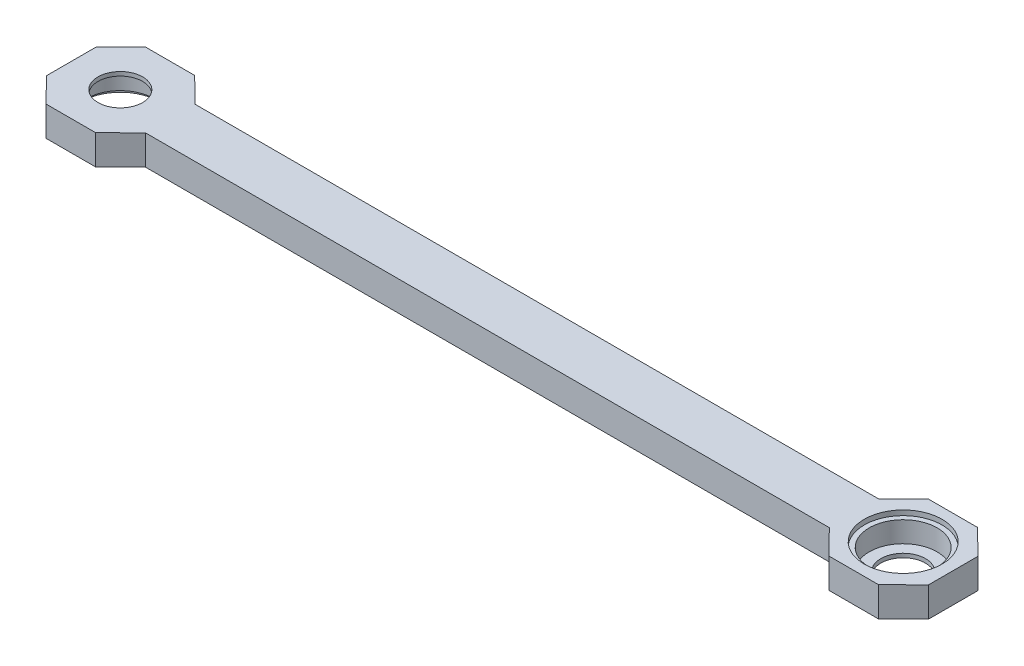
ISO-10303-21;
HEADER;
FILE_DESCRIPTION(('STEP AP214'),'2;1');
FILE_NAME('part.step','',(''),(''),'','','');
FILE_SCHEMA(('AUTOMOTIVE_DESIGN { 1 0 10303 214 1 1 1 1 }'));
ENDSEC;
DATA;
#1=APPLICATION_CONTEXT('core data for automotive mechanical design processes');
#2=APPLICATION_PROTOCOL_DEFINITION('international standard','automotive_design',2000,#1);
#3=PRODUCT_CONTEXT('',#1,'mechanical');
#4=PRODUCT('Part','Part','',(#3));
#5=PRODUCT_RELATED_PRODUCT_CATEGORY('part','',(#4));
#6=PRODUCT_DEFINITION_FORMATION('','',#4);
#7=PRODUCT_DEFINITION_CONTEXT('part definition',#1,'design');
#8=PRODUCT_DEFINITION('design','',#6,#7);
#9=PRODUCT_DEFINITION_SHAPE('','',#8);
#10=(LENGTH_UNIT() NAMED_UNIT(*) SI_UNIT(.MILLI.,.METRE.));
#11=(NAMED_UNIT(*) PLANE_ANGLE_UNIT() SI_UNIT($,.RADIAN.));
#12=(NAMED_UNIT(*) SI_UNIT($,.STERADIAN.) SOLID_ANGLE_UNIT());
#13=UNCERTAINTY_MEASURE_WITH_UNIT(LENGTH_MEASURE(1.E-05),#10,'distance_accuracy_value','');
#14=(GEOMETRIC_REPRESENTATION_CONTEXT(3) GLOBAL_UNCERTAINTY_ASSIGNED_CONTEXT((#13)) GLOBAL_UNIT_ASSIGNED_CONTEXT((#10,
#11,#12)) REPRESENTATION_CONTEXT('',''));
#15=CARTESIAN_POINT('',(0.,0.,0.));
#16=DIRECTION('',(0.,0.,1.));
#17=DIRECTION('',(1.,0.,0.));
#18=AXIS2_PLACEMENT_3D('',#15,#16,#17);
#19=CARTESIAN_POINT('',(-75.3633444841573,5.2,0.));
#20=DIRECTION('',(0.,-1.,0.));
#21=DIRECTION('',(0.,0.,-1.));
#22=AXIS2_PLACEMENT_3D('',#19,#20,#21);
#23=CYLINDRICAL_SURFACE('',#22,6.85);
#24=CARTESIAN_POINT('',(-75.3633444841573,5.2,0.));
#25=DIRECTION('',(0.,-1.,0.));
#26=DIRECTION('',(0.,0.,-1.));
#27=AXIS2_PLACEMENT_3D('',#24,#25,#26);
#28=CIRCLE('',#27,6.85);
#29=CARTESIAN_POINT('',(-75.3633444841573,5.2,-6.85));
#30=VERTEX_POINT('',#29);
#31=EDGE_CURVE('E260',#30,#30,#28,.T.);
#32=ORIENTED_EDGE('',*,*,#31,.F.);
#33=EDGE_LOOP('',(#32));
#34=FACE_BOUND('',#33,.T.);
#35=CARTESIAN_POINT('',(-75.3633444841573,1.,0.));
#36=DIRECTION('',(0.,-1.,0.));
#37=DIRECTION('',(0.,0.,-1.));
#38=AXIS2_PLACEMENT_3D('',#35,#36,#37);
#39=CIRCLE('',#38,6.85);
#40=CARTESIAN_POINT('',(-75.3633444841573,1.,-6.85));
#41=VERTEX_POINT('',#40);
#42=EDGE_CURVE('E38',#41,#41,#39,.F.);
#43=ORIENTED_EDGE('',*,*,#42,.F.);
#44=EDGE_LOOP('',(#43));
#45=FACE_BOUND('',#44,.T.);
#46=ADVANCED_FACE('F34',(#34,#45),#23,.F.);
#47=CARTESIAN_POINT('',(-75.3633444841573,6.,0.));
#48=DIRECTION('',(0.,-1.,0.));
#49=DIRECTION('',(0.,0.,-1.));
#50=AXIS2_PLACEMENT_3D('',#47,#48,#49);
#51=CYLINDRICAL_SURFACE('',#50,4.5);
#52=CARTESIAN_POINT('',(-75.3633444841573,6.,0.));
#53=DIRECTION('',(0.,1.,0.));
#54=DIRECTION('',(0.,0.,1.));
#55=AXIS2_PLACEMENT_3D('',#52,#53,#54);
#56=CIRCLE('',#55,4.5);
#57=CARTESIAN_POINT('',(-75.3633444841573,6.,4.5));
#58=VERTEX_POINT('',#57);
#59=EDGE_CURVE('E186',#58,#58,#56,.T.);
#60=ORIENTED_EDGE('',*,*,#59,.T.);
#61=EDGE_LOOP('',(#60));
#62=FACE_BOUND('',#61,.T.);
#63=CARTESIAN_POINT('',(-75.3633444841573,5.2,0.));
#64=DIRECTION('',(0.,-1.,0.));
#65=DIRECTION('',(0.,0.,-1.));
#66=AXIS2_PLACEMENT_3D('',#63,#64,#65);
#67=CIRCLE('',#66,4.5);
#68=CARTESIAN_POINT('',(-75.3633444841573,5.2,-4.5));
#69=VERTEX_POINT('',#68);
#70=EDGE_CURVE('E257',#69,#69,#67,.T.);
#71=ORIENTED_EDGE('',*,*,#70,.T.);
#72=EDGE_LOOP('',(#71));
#73=FACE_BOUND('',#72,.T.);
#74=ADVANCED_FACE('F336',(#62,#73),#51,.F.);
#75=CARTESIAN_POINT('',(82.6366555158427,0.8,0.));
#76=DIRECTION('',(0.,1.,0.));
#77=DIRECTION('',(0.,0.,1.));
#78=AXIS2_PLACEMENT_3D('',#75,#76,#77);
#79=CYLINDRICAL_SURFACE('',#78,6.85);
#80=CARTESIAN_POINT('',(82.6366555158427,0.8,0.));
#81=DIRECTION('',(0.,1.,0.));
#82=DIRECTION('',(0.,0.,1.));
#83=AXIS2_PLACEMENT_3D('',#80,#81,#82);
#84=CIRCLE('',#83,6.85);
#85=CARTESIAN_POINT('',(82.6366555158427,0.8,6.85));
#86=VERTEX_POINT('',#85);
#87=EDGE_CURVE('E253',#86,#86,#84,.T.);
#88=ORIENTED_EDGE('',*,*,#87,.F.);
#89=EDGE_LOOP('',(#88));
#90=FACE_BOUND('',#89,.T.);
#91=CARTESIAN_POINT('',(82.6366555158427,5.,0.));
#92=DIRECTION('',(0.,1.,0.));
#93=DIRECTION('',(0.,0.,1.));
#94=AXIS2_PLACEMENT_3D('',#91,#92,#93);
#95=CIRCLE('',#94,6.85);
#96=CARTESIAN_POINT('',(82.6366555158427,5.,6.85));
#97=VERTEX_POINT('',#96);
#98=EDGE_CURVE('E254',#97,#97,#95,.F.);
#99=ORIENTED_EDGE('',*,*,#98,.F.);
#100=EDGE_LOOP('',(#99));
#101=FACE_BOUND('',#100,.T.);
#102=ADVANCED_FACE('F342',(#90,#101),#79,.F.);
#103=CARTESIAN_POINT('',(82.6366555158427,6.,0.));
#104=DIRECTION('',(0.,-1.,0.));
#105=DIRECTION('',(0.,0.,-1.));
#106=AXIS2_PLACEMENT_3D('',#103,#104,#105);
#107=CYLINDRICAL_SURFACE('',#106,4.5);
#108=CARTESIAN_POINT('',(82.6366555158427,0.,0.));
#109=DIRECTION('',(0.,1.,0.));
#110=DIRECTION('',(0.,0.,1.));
#111=AXIS2_PLACEMENT_3D('',#108,#109,#110);
#112=CIRCLE('',#111,4.5);
#113=CARTESIAN_POINT('',(82.6366555158427,0.,4.5));
#114=VERTEX_POINT('',#113);
#115=EDGE_CURVE('E252',#114,#114,#112,.T.);
#116=ORIENTED_EDGE('',*,*,#115,.F.);
#117=EDGE_LOOP('',(#116));
#118=FACE_BOUND('',#117,.T.);
#119=CARTESIAN_POINT('',(82.6366555158427,0.8,0.));
#120=DIRECTION('',(0.,1.,0.));
#121=DIRECTION('',(0.,0.,1.));
#122=AXIS2_PLACEMENT_3D('',#119,#120,#121);
#123=CIRCLE('',#122,4.5);
#124=CARTESIAN_POINT('',(82.6366555158427,0.8,4.5));
#125=VERTEX_POINT('',#124);
#126=EDGE_CURVE('E249',#125,#125,#123,.T.);
#127=ORIENTED_EDGE('',*,*,#126,.T.);
#128=EDGE_LOOP('',(#127));
#129=FACE_BOUND('',#128,.T.);
#130=ADVANCED_FACE('F359',(#118,#129),#107,.F.);
#131=CARTESIAN_POINT('',(0.,6.,0.));
#132=DIRECTION('',(0.,-1.,0.));
#133=DIRECTION('',(0.,0.,-1.));
#134=AXIS2_PLACEMENT_3D('',#131,#132,#133);
#135=PLANE('',#134);
#136=CARTESIAN_POINT('',(82.6366555158427,6.,0.));
#137=DIRECTION('',(0.,1.,0.));
#138=DIRECTION('',(0.,0.,1.));
#139=AXIS2_PLACEMENT_3D('',#136,#137,#138);
#140=CIRCLE('',#139,7.84999999999999);
#141=CARTESIAN_POINT('',(82.6366555158427,6.,7.84999999999999));
#142=VERTEX_POINT('',#141);
#143=EDGE_CURVE('E259',#142,#142,#140,.T.);
#144=ORIENTED_EDGE('',*,*,#143,.F.);
#145=EDGE_LOOP('',(#144));
#146=FACE_BOUND('',#145,.T.);
#147=DIRECTION('',(-1.,0.,0.));
#148=VECTOR('',#147,1.);
#149=CARTESIAN_POINT('',(-65.2623239697237,6.,-5.));
#150=LINE('',#149,#148);
#151=CARTESIAN_POINT('',(72.7376760302763,6.,-5.));
#152=VERTEX_POINT('',#151);
#153=CARTESIAN_POINT('',(-65.2623239697237,6.,-5.));
#154=VERTEX_POINT('',#153);
#155=EDGE_CURVE('E213',#152,#154,#150,.T.);
#156=ORIENTED_EDGE('',*,*,#155,.T.);
#157=DIRECTION('',(-0.714142857145832,0.,-0.699999985419706));
#158=VECTOR('',#157,1.);
#159=CARTESIAN_POINT('',(-65.2623239697237,6.,-5.));
#160=LINE('',#159,#158);
#161=CARTESIAN_POINT('',(-70.3633444841573,6.,-10.));
#162=VERTEX_POINT('',#161);
#163=EDGE_CURVE('E120',#154,#162,#160,.T.);
#164=ORIENTED_EDGE('',*,*,#163,.T.);
#165=DIRECTION('',(-1.,0.,0.));
#166=VECTOR('',#165,1.);
#167=CARTESIAN_POINT('',(-70.3633444841573,6.,-10.));
#168=LINE('',#167,#166);
#169=CARTESIAN_POINT('',(-80.3633444841573,6.,-10.));
#170=VERTEX_POINT('',#169);
#171=EDGE_CURVE('E285',#162,#170,#168,.T.);
#172=ORIENTED_EDGE('',*,*,#171,.T.);
#173=DIRECTION('',(-0.699854212223766,0.,0.714285714285714));
#174=VECTOR('',#173,1.);
#175=CARTESIAN_POINT('',(-80.3633444841573,6.,-10.));
#176=LINE('',#175,#174);
#177=CARTESIAN_POINT('',(-85.2623239697237,6.,-5.));
#178=VERTEX_POINT('',#177);
#179=EDGE_CURVE('E287',#170,#178,#176,.T.);
#180=ORIENTED_EDGE('',*,*,#179,.T.);
#181=DIRECTION('',(0.,0.,1.));
#182=VECTOR('',#181,1.);
#183=CARTESIAN_POINT('',(-85.2623239697237,6.,-5.));
#184=LINE('',#183,#182);
#185=CARTESIAN_POINT('',(-85.2623239697237,6.,5.));
#186=VERTEX_POINT('',#185);
#187=EDGE_CURVE('E289',#178,#186,#184,.T.);
#188=ORIENTED_EDGE('',*,*,#187,.T.);
#189=DIRECTION('',(0.699854212223766,0.,0.714285714285714));
#190=VECTOR('',#189,1.);
#191=CARTESIAN_POINT('',(-80.3633444841573,6.,10.));
#192=LINE('',#191,#190);
#193=CARTESIAN_POINT('',(-80.3633444841573,6.,10.));
#194=VERTEX_POINT('',#193);
#195=EDGE_CURVE('E291',#186,#194,#192,.T.);
#196=ORIENTED_EDGE('',*,*,#195,.T.);
#197=DIRECTION('',(1.,0.,0.));
#198=VECTOR('',#197,1.);
#199=CARTESIAN_POINT('',(-70.3633444841573,6.,10.));
#200=LINE('',#199,#198);
#201=CARTESIAN_POINT('',(-70.3633444841573,6.,10.));
#202=VERTEX_POINT('',#201);
#203=EDGE_CURVE('E293',#194,#202,#200,.T.);
#204=ORIENTED_EDGE('',*,*,#203,.T.);
#205=DIRECTION('',(0.714142857145832,0.,-0.699999985419706));
#206=VECTOR('',#205,1.);
#207=CARTESIAN_POINT('',(-65.2623239697237,6.,5.));
#208=LINE('',#207,#206);
#209=CARTESIAN_POINT('',(-65.2623239697237,6.,5.));
#210=VERTEX_POINT('',#209);
#211=EDGE_CURVE('E295',#202,#210,#208,.T.);
#212=ORIENTED_EDGE('',*,*,#211,.T.);
#213=DIRECTION('',(1.,0.,0.));
#214=VECTOR('',#213,1.);
#215=CARTESIAN_POINT('',(72.7376760302763,6.,5.));
#216=LINE('',#215,#214);
#217=CARTESIAN_POINT('',(72.7376760302763,6.,5.));
#218=VERTEX_POINT('',#217);
#219=EDGE_CURVE('E297',#210,#218,#216,.T.);
#220=ORIENTED_EDGE('',*,*,#219,.T.);
#221=DIRECTION('',(0.699854212223765,0.,0.714285714285715));
#222=VECTOR('',#221,1.);
#223=CARTESIAN_POINT('',(72.7376760302763,6.,5.));
#224=LINE('',#223,#222);
#225=CARTESIAN_POINT('',(77.6366555158427,6.,10.));
#226=VERTEX_POINT('',#225);
#227=EDGE_CURVE('E299',#218,#226,#224,.T.);
#228=ORIENTED_EDGE('',*,*,#227,.T.);
#229=DIRECTION('',(1.,0.,0.));
#230=VECTOR('',#229,1.);
#231=CARTESIAN_POINT('',(77.6366555158427,6.,10.));
#232=LINE('',#231,#230);
#233=CARTESIAN_POINT('',(87.6366555158427,6.,10.));
#234=VERTEX_POINT('',#233);
#235=EDGE_CURVE('E301',#226,#234,#232,.T.);
#236=ORIENTED_EDGE('',*,*,#235,.T.);
#237=DIRECTION('',(0.714285714285716,0.,-0.699854212223764));
#238=VECTOR('',#237,1.);
#239=CARTESIAN_POINT('',(87.6366555158427,6.,10.));
#240=LINE('',#239,#238);
#241=CARTESIAN_POINT('',(92.739759146641,6.,5.));
#242=VERTEX_POINT('',#241);
#243=EDGE_CURVE('E303',#234,#242,#240,.T.);
#244=ORIENTED_EDGE('',*,*,#243,.T.);
#245=DIRECTION('',(0.,0.,-1.));
#246=VECTOR('',#245,1.);
#247=CARTESIAN_POINT('',(92.739759146641,6.,-5.));
#248=LINE('',#247,#246);
#249=CARTESIAN_POINT('',(92.739759146641,6.,-5.));
#250=VERTEX_POINT('',#249);
#251=EDGE_CURVE('E164',#242,#250,#248,.T.);
#252=ORIENTED_EDGE('',*,*,#251,.T.);
#253=DIRECTION('',(-0.714285714285716,0.,-0.699854212223764));
#254=VECTOR('',#253,1.);
#255=CARTESIAN_POINT('',(87.6366555158427,6.,-10.));
#256=LINE('',#255,#254);
#257=CARTESIAN_POINT('',(87.6366555158427,6.,-10.));
#258=VERTEX_POINT('',#257);
#259=EDGE_CURVE('E157',#250,#258,#256,.T.);
#260=ORIENTED_EDGE('',*,*,#259,.T.);
#261=DIRECTION('',(-1.,0.,0.));
#262=VECTOR('',#261,1.);
#263=CARTESIAN_POINT('',(77.6366555158427,6.,-10.));
#264=LINE('',#263,#262);
#265=CARTESIAN_POINT('',(77.6366555158427,6.,-10.));
#266=VERTEX_POINT('',#265);
#267=EDGE_CURVE('E162',#258,#266,#264,.T.);
#268=ORIENTED_EDGE('',*,*,#267,.T.);
#269=DIRECTION('',(-0.699854212223765,0.,0.714285714285715));
#270=VECTOR('',#269,1.);
#271=CARTESIAN_POINT('',(72.7376760302763,6.,-5.));
#272=LINE('',#271,#270);
#273=EDGE_CURVE('E53',#266,#152,#272,.T.);
#274=ORIENTED_EDGE('',*,*,#273,.T.);
#275=EDGE_LOOP('',(#156,#164,#172,#180,#188,#196,#204,#212,#220,#228,#236,#244,#252,#260,#268,#274));
#276=FACE_BOUND('',#275,.T.);
#277=ORIENTED_EDGE('',*,*,#59,.F.);
#278=EDGE_LOOP('',(#277));
#279=FACE_BOUND('',#278,.T.);
#280=ADVANCED_FACE('F159',(#146,#276,#279),#135,.F.);
#281=CARTESIAN_POINT('',(0.,0.,0.));
#282=DIRECTION('',(0.,-1.,0.));
#283=DIRECTION('',(0.,0.,-1.));
#284=AXIS2_PLACEMENT_3D('',#281,#282,#283);
#285=PLANE('',#284);
#286=CARTESIAN_POINT('',(-75.3633444841573,0.,0.));
#287=DIRECTION('',(0.,-1.,0.));
#288=DIRECTION('',(0.,0.,-1.));
#289=AXIS2_PLACEMENT_3D('',#286,#287,#288);
#290=CIRCLE('',#289,7.84999999999999);
#291=CARTESIAN_POINT('',(-75.3633444841573,0.,-7.84999999999999));
#292=VERTEX_POINT('',#291);
#293=EDGE_CURVE('E273',#292,#292,#290,.T.);
#294=ORIENTED_EDGE('',*,*,#293,.F.);
#295=EDGE_LOOP('',(#294));
#296=FACE_BOUND('',#295,.T.);
#297=DIRECTION('',(-1.,0.,0.));
#298=VECTOR('',#297,1.);
#299=CARTESIAN_POINT('',(-65.2623239697237,0.,-5.));
#300=LINE('',#299,#298);
#301=CARTESIAN_POINT('',(72.7376760302763,0.,-5.));
#302=VERTEX_POINT('',#301);
#303=CARTESIAN_POINT('',(-65.2623239697237,0.,-5.));
#304=VERTEX_POINT('',#303);
#305=EDGE_CURVE('E182',#302,#304,#300,.T.);
#306=ORIENTED_EDGE('',*,*,#305,.F.);
#307=DIRECTION('',(-0.699854212223765,0.,0.714285714285715));
#308=VECTOR('',#307,1.);
#309=CARTESIAN_POINT('',(72.7376760302763,0.,-5.));
#310=LINE('',#309,#308);
#311=CARTESIAN_POINT('',(77.6366555158427,0.,-10.));
#312=VERTEX_POINT('',#311);
#313=EDGE_CURVE('E112',#312,#302,#310,.T.);
#314=ORIENTED_EDGE('',*,*,#313,.F.);
#315=DIRECTION('',(-1.,0.,0.));
#316=VECTOR('',#315,1.);
#317=CARTESIAN_POINT('',(77.6366555158427,0.,-10.));
#318=LINE('',#317,#316);
#319=CARTESIAN_POINT('',(87.6366555158427,0.,-10.));
#320=VERTEX_POINT('',#319);
#321=EDGE_CURVE('E106',#320,#312,#318,.T.);
#322=ORIENTED_EDGE('',*,*,#321,.F.);
#323=DIRECTION('',(-0.714285714285716,0.,-0.699854212223764));
#324=VECTOR('',#323,1.);
#325=CARTESIAN_POINT('',(87.6366555158427,0.,-10.));
#326=LINE('',#325,#324);
#327=CARTESIAN_POINT('',(92.739759146641,0.,-5.));
#328=VERTEX_POINT('',#327);
#329=EDGE_CURVE('E172',#328,#320,#326,.T.);
#330=ORIENTED_EDGE('',*,*,#329,.F.);
#331=DIRECTION('',(0.,0.,-1.));
#332=VECTOR('',#331,1.);
#333=CARTESIAN_POINT('',(92.739759146641,0.,-5.));
#334=LINE('',#333,#332);
#335=CARTESIAN_POINT('',(92.739759146641,0.,5.));
#336=VERTEX_POINT('',#335);
#337=EDGE_CURVE('E208',#336,#328,#334,.T.);
#338=ORIENTED_EDGE('',*,*,#337,.F.);
#339=DIRECTION('',(0.714285714285716,0.,-0.699854212223764));
#340=VECTOR('',#339,1.);
#341=CARTESIAN_POINT('',(87.6366555158427,0.,10.));
#342=LINE('',#341,#340);
#343=CARTESIAN_POINT('',(87.6366555158427,0.,10.));
#344=VERTEX_POINT('',#343);
#345=EDGE_CURVE('E206',#344,#336,#342,.T.);
#346=ORIENTED_EDGE('',*,*,#345,.F.);
#347=DIRECTION('',(1.,0.,0.));
#348=VECTOR('',#347,1.);
#349=CARTESIAN_POINT('',(77.6366555158427,0.,10.));
#350=LINE('',#349,#348);
#351=CARTESIAN_POINT('',(77.6366555158427,0.,10.));
#352=VERTEX_POINT('',#351);
#353=EDGE_CURVE('E204',#352,#344,#350,.T.);
#354=ORIENTED_EDGE('',*,*,#353,.F.);
#355=DIRECTION('',(0.699854212223765,0.,0.714285714285715));
#356=VECTOR('',#355,1.);
#357=CARTESIAN_POINT('',(72.7376760302763,0.,5.));
#358=LINE('',#357,#356);
#359=CARTESIAN_POINT('',(72.7376760302763,0.,5.));
#360=VERTEX_POINT('',#359);
#361=EDGE_CURVE('E202',#360,#352,#358,.T.);
#362=ORIENTED_EDGE('',*,*,#361,.F.);
#363=DIRECTION('',(1.,0.,0.));
#364=VECTOR('',#363,1.);
#365=CARTESIAN_POINT('',(72.7376760302763,0.,5.));
#366=LINE('',#365,#364);
#367=CARTESIAN_POINT('',(-65.2623239697237,0.,5.));
#368=VERTEX_POINT('',#367);
#369=EDGE_CURVE('E200',#368,#360,#366,.T.);
#370=ORIENTED_EDGE('',*,*,#369,.F.);
#371=DIRECTION('',(0.714142857145832,0.,-0.699999985419706));
#372=VECTOR('',#371,1.);
#373=CARTESIAN_POINT('',(-65.2623239697237,0.,5.));
#374=LINE('',#373,#372);
#375=CARTESIAN_POINT('',(-70.3633444841573,0.,10.));
#376=VERTEX_POINT('',#375);
#377=EDGE_CURVE('E198',#376,#368,#374,.T.);
#378=ORIENTED_EDGE('',*,*,#377,.F.);
#379=DIRECTION('',(1.,0.,0.));
#380=VECTOR('',#379,1.);
#381=CARTESIAN_POINT('',(-70.3633444841573,0.,10.));
#382=LINE('',#381,#380);
#383=CARTESIAN_POINT('',(-80.3633444841573,0.,10.));
#384=VERTEX_POINT('',#383);
#385=EDGE_CURVE('E196',#384,#376,#382,.T.);
#386=ORIENTED_EDGE('',*,*,#385,.F.);
#387=DIRECTION('',(0.699854212223766,0.,0.714285714285714));
#388=VECTOR('',#387,1.);
#389=CARTESIAN_POINT('',(-80.3633444841573,0.,10.));
#390=LINE('',#389,#388);
#391=CARTESIAN_POINT('',(-85.2623239697237,0.,5.));
#392=VERTEX_POINT('',#391);
#393=EDGE_CURVE('E194',#392,#384,#390,.T.);
#394=ORIENTED_EDGE('',*,*,#393,.F.);
#395=DIRECTION('',(0.,0.,1.));
#396=VECTOR('',#395,1.);
#397=CARTESIAN_POINT('',(-85.2623239697237,0.,-5.));
#398=LINE('',#397,#396);
#399=CARTESIAN_POINT('',(-85.2623239697237,0.,-5.));
#400=VERTEX_POINT('',#399);
#401=EDGE_CURVE('E192',#400,#392,#398,.T.);
#402=ORIENTED_EDGE('',*,*,#401,.F.);
#403=DIRECTION('',(-0.699854212223766,0.,0.714285714285714));
#404=VECTOR('',#403,1.);
#405=CARTESIAN_POINT('',(-80.3633444841573,0.,-10.));
#406=LINE('',#405,#404);
#407=CARTESIAN_POINT('',(-80.3633444841573,0.,-10.));
#408=VERTEX_POINT('',#407);
#409=EDGE_CURVE('E190',#408,#400,#406,.T.);
#410=ORIENTED_EDGE('',*,*,#409,.F.);
#411=DIRECTION('',(-1.,0.,0.));
#412=VECTOR('',#411,1.);
#413=CARTESIAN_POINT('',(-70.3633444841573,0.,-10.));
#414=LINE('',#413,#412);
#415=CARTESIAN_POINT('',(-70.3633444841573,0.,-10.));
#416=VERTEX_POINT('',#415);
#417=EDGE_CURVE('E188',#416,#408,#414,.T.);
#418=ORIENTED_EDGE('',*,*,#417,.F.);
#419=DIRECTION('',(-0.714142857145832,0.,-0.699999985419706));
#420=VECTOR('',#419,1.);
#421=CARTESIAN_POINT('',(-65.2623239697237,0.,-5.));
#422=LINE('',#421,#420);
#423=EDGE_CURVE('E185',#304,#416,#422,.T.);
#424=ORIENTED_EDGE('',*,*,#423,.F.);
#425=EDGE_LOOP('',(#306,#314,#322,#330,#338,#346,#354,#362,#370,#378,#386,#394,#402,#410,#418,#424));
#426=FACE_BOUND('',#425,.T.);
#427=ORIENTED_EDGE('',*,*,#115,.T.);
#428=EDGE_LOOP('',(#427));
#429=FACE_BOUND('',#428,.T.);
#430=ADVANCED_FACE('F316',(#296,#426,#429),#285,.T.);
#431=CARTESIAN_POINT('',(-65.2623239697237,6.,-5.));
#432=DIRECTION('',(0.,0.,1.));
#433=DIRECTION('',(1.,0.,0.));
#434=AXIS2_PLACEMENT_3D('',#431,#432,#433);
#435=PLANE('',#434);
#436=ORIENTED_EDGE('',*,*,#305,.T.);
#437=DIRECTION('',(0.,-1.,0.));
#438=VECTOR('',#437,1.);
#439=CARTESIAN_POINT('',(-65.2623239697237,6.,-5.));
#440=LINE('',#439,#438);
#441=EDGE_CURVE('E11',#154,#304,#440,.T.);
#442=ORIENTED_EDGE('',*,*,#441,.F.);
#443=ORIENTED_EDGE('',*,*,#155,.F.);
#444=DIRECTION('',(0.,-1.,0.));
#445=VECTOR('',#444,1.);
#446=CARTESIAN_POINT('',(72.7376760302763,6.,-5.));
#447=LINE('',#446,#445);
#448=EDGE_CURVE('E178',#152,#302,#447,.T.);
#449=ORIENTED_EDGE('',*,*,#448,.T.);
#450=EDGE_LOOP('',(#436,#442,#443,#449));
#451=FACE_BOUND('',#450,.T.);
#452=ADVANCED_FACE('F36',(#451),#435,.F.);
#453=CARTESIAN_POINT('',(-65.2623239697237,6.,-5.));
#454=DIRECTION('',(-0.699999985419706,0.,0.714142857145832));
#455=DIRECTION('',(0.714142857145832,0.,0.699999985419706));
#456=AXIS2_PLACEMENT_3D('',#453,#454,#455);
#457=PLANE('',#456);
#458=ORIENTED_EDGE('',*,*,#423,.T.);
#459=DIRECTION('',(0.,-1.,0.));
#460=VECTOR('',#459,1.);
#461=CARTESIAN_POINT('',(-70.3633444841573,6.,-10.));
#462=LINE('',#461,#460);
#463=EDGE_CURVE('E44',#162,#416,#462,.T.);
#464=ORIENTED_EDGE('',*,*,#463,.F.);
#465=ORIENTED_EDGE('',*,*,#163,.F.);
#466=ORIENTED_EDGE('',*,*,#441,.T.);
#467=EDGE_LOOP('',(#458,#464,#465,#466));
#468=FACE_BOUND('',#467,.T.);
#469=ADVANCED_FACE('F371',(#468),#457,.F.);
#470=CARTESIAN_POINT('',(-70.3633444841573,6.,-10.));
#471=DIRECTION('',(0.,0.,1.));
#472=DIRECTION('',(1.,0.,0.));
#473=AXIS2_PLACEMENT_3D('',#470,#471,#472);
#474=PLANE('',#473);
#475=ORIENTED_EDGE('',*,*,#417,.T.);
#476=DIRECTION('',(0.,-1.,0.));
#477=VECTOR('',#476,1.);
#478=CARTESIAN_POINT('',(-80.3633444841573,6.,-10.));
#479=LINE('',#478,#477);
#480=EDGE_CURVE('E244',#170,#408,#479,.T.);
#481=ORIENTED_EDGE('',*,*,#480,.F.);
#482=ORIENTED_EDGE('',*,*,#171,.F.);
#483=ORIENTED_EDGE('',*,*,#463,.T.);
#484=EDGE_LOOP('',(#475,#481,#482,#483));
#485=FACE_BOUND('',#484,.T.);
#486=ADVANCED_FACE('F441',(#485),#474,.F.);
#487=CARTESIAN_POINT('',(-80.3633444841573,6.,-10.));
#488=DIRECTION('',(0.714285714285714,0.,0.699854212223766));
#489=DIRECTION('',(0.699854212223766,0.,-0.714285714285714));
#490=AXIS2_PLACEMENT_3D('',#487,#488,#489);
#491=PLANE('',#490);
#492=ORIENTED_EDGE('',*,*,#409,.T.);
#493=DIRECTION('',(0.,-1.,0.));
#494=VECTOR('',#493,1.);
#495=CARTESIAN_POINT('',(-85.2623239697237,6.,-5.));
#496=LINE('',#495,#494);
#497=EDGE_CURVE('E241',#178,#400,#496,.T.);
#498=ORIENTED_EDGE('',*,*,#497,.F.);
#499=ORIENTED_EDGE('',*,*,#179,.F.);
#500=ORIENTED_EDGE('',*,*,#480,.T.);
#501=EDGE_LOOP('',(#492,#498,#499,#500));
#502=FACE_BOUND('',#501,.T.);
#503=ADVANCED_FACE('F448',(#502),#491,.F.);
#504=CARTESIAN_POINT('',(-85.2623239697237,6.,-5.));
#505=DIRECTION('',(1.,0.,0.));
#506=DIRECTION('',(0.,0.,-1.));
#507=AXIS2_PLACEMENT_3D('',#504,#505,#506);
#508=PLANE('',#507);
#509=ORIENTED_EDGE('',*,*,#401,.T.);
#510=DIRECTION('',(0.,-1.,0.));
#511=VECTOR('',#510,1.);
#512=CARTESIAN_POINT('',(-85.2623239697237,6.,5.));
#513=LINE('',#512,#511);
#514=EDGE_CURVE('E238',#186,#392,#513,.T.);
#515=ORIENTED_EDGE('',*,*,#514,.F.);
#516=ORIENTED_EDGE('',*,*,#187,.F.);
#517=ORIENTED_EDGE('',*,*,#497,.T.);
#518=EDGE_LOOP('',(#509,#515,#516,#517));
#519=FACE_BOUND('',#518,.T.);
#520=ADVANCED_FACE('F457',(#519),#508,.F.);
#521=CARTESIAN_POINT('',(-80.3633444841573,6.,10.));
#522=DIRECTION('',(0.714285714285714,0.,-0.699854212223765));
#523=DIRECTION('',(-0.699854212223765,0.,-0.714285714285714));
#524=AXIS2_PLACEMENT_3D('',#521,#522,#523);
#525=PLANE('',#524);
#526=ORIENTED_EDGE('',*,*,#393,.T.);
#527=DIRECTION('',(0.,-1.,0.));
#528=VECTOR('',#527,1.);
#529=CARTESIAN_POINT('',(-80.3633444841573,6.,10.));
#530=LINE('',#529,#528);
#531=EDGE_CURVE('E235',#194,#384,#530,.T.);
#532=ORIENTED_EDGE('',*,*,#531,.F.);
#533=ORIENTED_EDGE('',*,*,#195,.F.);
#534=ORIENTED_EDGE('',*,*,#514,.T.);
#535=EDGE_LOOP('',(#526,#532,#533,#534));
#536=FACE_BOUND('',#535,.T.);
#537=ADVANCED_FACE('F466',(#536),#525,.F.);
#538=CARTESIAN_POINT('',(-70.3633444841573,6.,10.));
#539=DIRECTION('',(0.,0.,-1.));
#540=DIRECTION('',(-1.,0.,0.));
#541=AXIS2_PLACEMENT_3D('',#538,#539,#540);
#542=PLANE('',#541);
#543=ORIENTED_EDGE('',*,*,#385,.T.);
#544=DIRECTION('',(0.,-1.,0.));
#545=VECTOR('',#544,1.);
#546=CARTESIAN_POINT('',(-70.3633444841573,6.,10.));
#547=LINE('',#546,#545);
#548=EDGE_CURVE('E232',#202,#376,#547,.T.);
#549=ORIENTED_EDGE('',*,*,#548,.F.);
#550=ORIENTED_EDGE('',*,*,#203,.F.);
#551=ORIENTED_EDGE('',*,*,#531,.T.);
#552=EDGE_LOOP('',(#543,#549,#550,#551));
#553=FACE_BOUND('',#552,.T.);
#554=ADVANCED_FACE('F475',(#553),#542,.F.);
#555=CARTESIAN_POINT('',(-65.2623239697237,6.,5.));
#556=DIRECTION('',(-0.699999985419706,0.,-0.714142857145832));
#557=DIRECTION('',(-0.714142857145832,0.,0.699999985419706));
#558=AXIS2_PLACEMENT_3D('',#555,#556,#557);
#559=PLANE('',#558);
#560=ORIENTED_EDGE('',*,*,#377,.T.);
#561=DIRECTION('',(0.,-1.,0.));
#562=VECTOR('',#561,1.);
#563=CARTESIAN_POINT('',(-65.2623239697237,6.,5.));
#564=LINE('',#563,#562);
#565=EDGE_CURVE('E229',#210,#368,#564,.T.);
#566=ORIENTED_EDGE('',*,*,#565,.F.);
#567=ORIENTED_EDGE('',*,*,#211,.F.);
#568=ORIENTED_EDGE('',*,*,#548,.T.);
#569=EDGE_LOOP('',(#560,#566,#567,#568));
#570=FACE_BOUND('',#569,.T.);
#571=ADVANCED_FACE('F484',(#570),#559,.F.);
#572=CARTESIAN_POINT('',(72.7376760302763,6.,5.));
#573=DIRECTION('',(0.,0.,-1.));
#574=DIRECTION('',(-1.,0.,0.));
#575=AXIS2_PLACEMENT_3D('',#572,#573,#574);
#576=PLANE('',#575);
#577=ORIENTED_EDGE('',*,*,#369,.T.);
#578=DIRECTION('',(0.,-1.,0.));
#579=VECTOR('',#578,1.);
#580=CARTESIAN_POINT('',(72.7376760302763,6.,5.));
#581=LINE('',#580,#579);
#582=EDGE_CURVE('E226',#218,#360,#581,.T.);
#583=ORIENTED_EDGE('',*,*,#582,.F.);
#584=ORIENTED_EDGE('',*,*,#219,.F.);
#585=ORIENTED_EDGE('',*,*,#565,.T.);
#586=EDGE_LOOP('',(#577,#583,#584,#585));
#587=FACE_BOUND('',#586,.T.);
#588=ADVANCED_FACE('F493',(#587),#576,.F.);
#589=CARTESIAN_POINT('',(72.7376760302763,6.,5.));
#590=DIRECTION('',(0.714285714285715,0.,-0.699854212223764));
#591=DIRECTION('',(-0.699854212223764,0.,-0.714285714285715));
#592=AXIS2_PLACEMENT_3D('',#589,#590,#591);
#593=PLANE('',#592);
#594=ORIENTED_EDGE('',*,*,#361,.T.);
#595=DIRECTION('',(0.,-1.,0.));
#596=VECTOR('',#595,1.);
#597=CARTESIAN_POINT('',(77.6366555158427,6.,10.));
#598=LINE('',#597,#596);
#599=EDGE_CURVE('E223',#226,#352,#598,.T.);
#600=ORIENTED_EDGE('',*,*,#599,.F.);
#601=ORIENTED_EDGE('',*,*,#227,.F.);
#602=ORIENTED_EDGE('',*,*,#582,.T.);
#603=EDGE_LOOP('',(#594,#600,#601,#602));
#604=FACE_BOUND('',#603,.T.);
#605=ADVANCED_FACE('F502',(#604),#593,.F.);
#606=CARTESIAN_POINT('',(77.6366555158427,6.,10.));
#607=DIRECTION('',(0.,0.,-1.));
#608=DIRECTION('',(-1.,0.,0.));
#609=AXIS2_PLACEMENT_3D('',#606,#607,#608);
#610=PLANE('',#609);
#611=ORIENTED_EDGE('',*,*,#353,.T.);
#612=DIRECTION('',(0.,-1.,0.));
#613=VECTOR('',#612,1.);
#614=CARTESIAN_POINT('',(87.6366555158427,6.,10.));
#615=LINE('',#614,#613);
#616=EDGE_CURVE('E220',#234,#344,#615,.T.);
#617=ORIENTED_EDGE('',*,*,#616,.F.);
#618=ORIENTED_EDGE('',*,*,#235,.F.);
#619=ORIENTED_EDGE('',*,*,#599,.T.);
#620=EDGE_LOOP('',(#611,#617,#618,#619));
#621=FACE_BOUND('',#620,.T.);
#622=ADVANCED_FACE('F511',(#621),#610,.F.);
#623=CARTESIAN_POINT('',(87.6366555158427,6.,10.));
#624=DIRECTION('',(-0.699854212223764,0.,-0.714285714285716));
#625=DIRECTION('',(-0.714285714285716,0.,0.699854212223764));
#626=AXIS2_PLACEMENT_3D('',#623,#624,#625);
#627=PLANE('',#626);
#628=ORIENTED_EDGE('',*,*,#345,.T.);
#629=DIRECTION('',(0.,-1.,0.));
#630=VECTOR('',#629,1.);
#631=CARTESIAN_POINT('',(92.739759146641,6.,5.));
#632=LINE('',#631,#630);
#633=EDGE_CURVE('E217',#242,#336,#632,.T.);
#634=ORIENTED_EDGE('',*,*,#633,.F.);
#635=ORIENTED_EDGE('',*,*,#243,.F.);
#636=ORIENTED_EDGE('',*,*,#616,.T.);
#637=EDGE_LOOP('',(#628,#634,#635,#636));
#638=FACE_BOUND('',#637,.T.);
#639=ADVANCED_FACE('F309',(#638),#627,.F.);
#640=CARTESIAN_POINT('',(92.739759146641,6.,-5.));
#641=DIRECTION('',(-1.,0.,0.));
#642=DIRECTION('',(0.,0.,1.));
#643=AXIS2_PLACEMENT_3D('',#640,#641,#642);
#644=PLANE('',#643);
#645=ORIENTED_EDGE('',*,*,#337,.T.);
#646=DIRECTION('',(0.,-1.,0.));
#647=VECTOR('',#646,1.);
#648=CARTESIAN_POINT('',(92.739759146641,6.,-5.));
#649=LINE('',#648,#647);
#650=EDGE_CURVE('E173',#250,#328,#649,.T.);
#651=ORIENTED_EDGE('',*,*,#650,.F.);
#652=ORIENTED_EDGE('',*,*,#251,.F.);
#653=ORIENTED_EDGE('',*,*,#633,.T.);
#654=EDGE_LOOP('',(#645,#651,#652,#653));
#655=FACE_BOUND('',#654,.T.);
#656=ADVANCED_FACE('F313',(#655),#644,.F.);
#657=CARTESIAN_POINT('',(87.6366555158427,6.,-10.));
#658=DIRECTION('',(-0.699854212223764,0.,0.714285714285716));
#659=DIRECTION('',(0.714285714285716,0.,0.699854212223764));
#660=AXIS2_PLACEMENT_3D('',#657,#658,#659);
#661=PLANE('',#660);
#662=ORIENTED_EDGE('',*,*,#329,.T.);
#663=DIRECTION('',(0.,-1.,0.));
#664=VECTOR('',#663,1.);
#665=CARTESIAN_POINT('',(87.6366555158427,6.,-10.));
#666=LINE('',#665,#664);
#667=EDGE_CURVE('E169',#258,#320,#666,.T.);
#668=ORIENTED_EDGE('',*,*,#667,.F.);
#669=ORIENTED_EDGE('',*,*,#259,.F.);
#670=ORIENTED_EDGE('',*,*,#650,.T.);
#671=EDGE_LOOP('',(#662,#668,#669,#670));
#672=FACE_BOUND('',#671,.T.);
#673=ADVANCED_FACE('F170',(#672),#661,.F.);
#674=CARTESIAN_POINT('',(77.6366555158427,6.,-10.));
#675=DIRECTION('',(0.,0.,1.));
#676=DIRECTION('',(1.,0.,0.));
#677=AXIS2_PLACEMENT_3D('',#674,#675,#676);
#678=PLANE('',#677);
#679=ORIENTED_EDGE('',*,*,#321,.T.);
#680=DIRECTION('',(0.,-1.,0.));
#681=VECTOR('',#680,1.);
#682=CARTESIAN_POINT('',(77.6366555158427,6.,-10.));
#683=LINE('',#682,#681);
#684=EDGE_CURVE('E174',#266,#312,#683,.T.);
#685=ORIENTED_EDGE('',*,*,#684,.F.);
#686=ORIENTED_EDGE('',*,*,#267,.F.);
#687=ORIENTED_EDGE('',*,*,#667,.T.);
#688=EDGE_LOOP('',(#679,#685,#686,#687));
#689=FACE_BOUND('',#688,.T.);
#690=ADVANCED_FACE('F176',(#689),#678,.F.);
#691=CARTESIAN_POINT('',(72.7376760302763,6.,-5.));
#692=DIRECTION('',(0.714285714285715,0.,0.699854212223764));
#693=DIRECTION('',(0.699854212223764,0.,-0.714285714285715));
#694=AXIS2_PLACEMENT_3D('',#691,#692,#693);
#695=PLANE('',#694);
#696=ORIENTED_EDGE('',*,*,#313,.T.);
#697=ORIENTED_EDGE('',*,*,#448,.F.);
#698=ORIENTED_EDGE('',*,*,#273,.F.);
#699=ORIENTED_EDGE('',*,*,#684,.T.);
#700=EDGE_LOOP('',(#696,#697,#698,#699));
#701=FACE_BOUND('',#700,.T.);
#702=ADVANCED_FACE('F322',(#701),#695,.F.);
#703=CARTESIAN_POINT('',(82.6366555158427,0.8,0.));
#704=DIRECTION('',(0.,1.,0.));
#705=DIRECTION('',(0.,0.,1.));
#706=AXIS2_PLACEMENT_3D('',#703,#704,#705);
#707=PLANE('',#706);
#708=ORIENTED_EDGE('',*,*,#126,.F.);
#709=EDGE_LOOP('',(#708));
#710=FACE_BOUND('',#709,.T.);
#711=ORIENTED_EDGE('',*,*,#87,.T.);
#712=EDGE_LOOP('',(#711));
#713=FACE_BOUND('',#712,.T.);
#714=ADVANCED_FACE('F324',(#710,#713),#707,.T.);
#715=CARTESIAN_POINT('',(82.6366555158427,5.,0.));
#716=DIRECTION('',(0.,1.,0.));
#717=DIRECTION('',(0.,0.,1.));
#718=AXIS2_PLACEMENT_3D('',#715,#716,#717);
#719=PLANE('',#718);
#720=CARTESIAN_POINT('',(82.6366555158427,5.,0.));
#721=DIRECTION('',(0.,1.,0.));
#722=DIRECTION('',(0.,0.,1.));
#723=AXIS2_PLACEMENT_3D('',#720,#721,#722);
#724=CIRCLE('',#723,7.84999999999999);
#725=CARTESIAN_POINT('',(82.6366555158427,5.,7.84999999999999));
#726=VERTEX_POINT('',#725);
#727=EDGE_CURVE('E256',#726,#726,#724,.T.);
#728=ORIENTED_EDGE('',*,*,#727,.T.);
#729=EDGE_LOOP('',(#728));
#730=FACE_BOUND('',#729,.T.);
#731=ORIENTED_EDGE('',*,*,#98,.T.);
#732=EDGE_LOOP('',(#731));
#733=FACE_BOUND('',#732,.T.);
#734=ADVANCED_FACE('F330',(#730,#733),#719,.T.);
#735=CARTESIAN_POINT('',(82.6366555158427,5.,0.));
#736=DIRECTION('',(0.,1.,0.));
#737=DIRECTION('',(0.,0.,1.));
#738=AXIS2_PLACEMENT_3D('',#735,#736,#737);
#739=CYLINDRICAL_SURFACE('',#738,7.84999999999999);
#740=ORIENTED_EDGE('',*,*,#727,.F.);
#741=EDGE_LOOP('',(#740));
#742=FACE_BOUND('',#741,.T.);
#743=ORIENTED_EDGE('',*,*,#143,.T.);
#744=EDGE_LOOP('',(#743));
#745=FACE_BOUND('',#744,.T.);
#746=ADVANCED_FACE('F352',(#742,#745),#739,.F.);
#747=CARTESIAN_POINT('',(-75.3633444841573,5.2,0.));
#748=DIRECTION('',(0.,-1.,0.));
#749=DIRECTION('',(0.,0.,-1.));
#750=AXIS2_PLACEMENT_3D('',#747,#748,#749);
#751=PLANE('',#750);
#752=ORIENTED_EDGE('',*,*,#70,.F.);
#753=EDGE_LOOP('',(#752));
#754=FACE_BOUND('',#753,.T.);
#755=ORIENTED_EDGE('',*,*,#31,.T.);
#756=EDGE_LOOP('',(#755));
#757=FACE_BOUND('',#756,.T.);
#758=ADVANCED_FACE('F348',(#754,#757),#751,.T.);
#759=CARTESIAN_POINT('',(-75.3633444841573,1.,0.));
#760=DIRECTION('',(0.,-1.,0.));
#761=DIRECTION('',(0.,0.,-1.));
#762=AXIS2_PLACEMENT_3D('',#759,#760,#761);
#763=PLANE('',#762);
#764=CARTESIAN_POINT('',(-75.3633444841573,1.,0.));
#765=DIRECTION('',(0.,-1.,0.));
#766=DIRECTION('',(0.,0.,-1.));
#767=AXIS2_PLACEMENT_3D('',#764,#765,#766);
#768=CIRCLE('',#767,7.84999999999999);
#769=CARTESIAN_POINT('',(-75.3633444841573,1.,-7.84999999999999));
#770=VERTEX_POINT('',#769);
#771=EDGE_CURVE('E270',#770,#770,#768,.T.);
#772=ORIENTED_EDGE('',*,*,#771,.T.);
#773=EDGE_LOOP('',(#772));
#774=FACE_BOUND('',#773,.T.);
#775=ORIENTED_EDGE('',*,*,#42,.T.);
#776=EDGE_LOOP('',(#775));
#777=FACE_BOUND('',#776,.T.);
#778=ADVANCED_FACE('F378',(#774,#777),#763,.T.);
#779=CARTESIAN_POINT('',(-75.3633444841573,1.,0.));
#780=DIRECTION('',(0.,-1.,0.));
#781=DIRECTION('',(0.,0.,-1.));
#782=AXIS2_PLACEMENT_3D('',#779,#780,#781);
#783=CYLINDRICAL_SURFACE('',#782,7.84999999999999);
#784=ORIENTED_EDGE('',*,*,#771,.F.);
#785=EDGE_LOOP('',(#784));
#786=FACE_BOUND('',#785,.T.);
#787=ORIENTED_EDGE('',*,*,#293,.T.);
#788=EDGE_LOOP('',(#787));
#789=FACE_BOUND('',#788,.T.);
#790=ADVANCED_FACE('F381',(#786,#789),#783,.F.);
#791=CLOSED_SHELL('',(#46,#74,#102,#130,#280,#430,#452,#469,#486,#503,#520,#537,#554,#571,#588,
#605,#622,#639,#656,#673,#690,#702,#714,#734,#746,#758,#778,#790));
#792=MANIFOLD_SOLID_BREP('B2',#791);
#793=ADVANCED_BREP_SHAPE_REPRESENTATION('',(#18,#792),#14);
#794=SHAPE_DEFINITION_REPRESENTATION(#9,#793);
ENDSEC;
END-ISO-10303-21;
